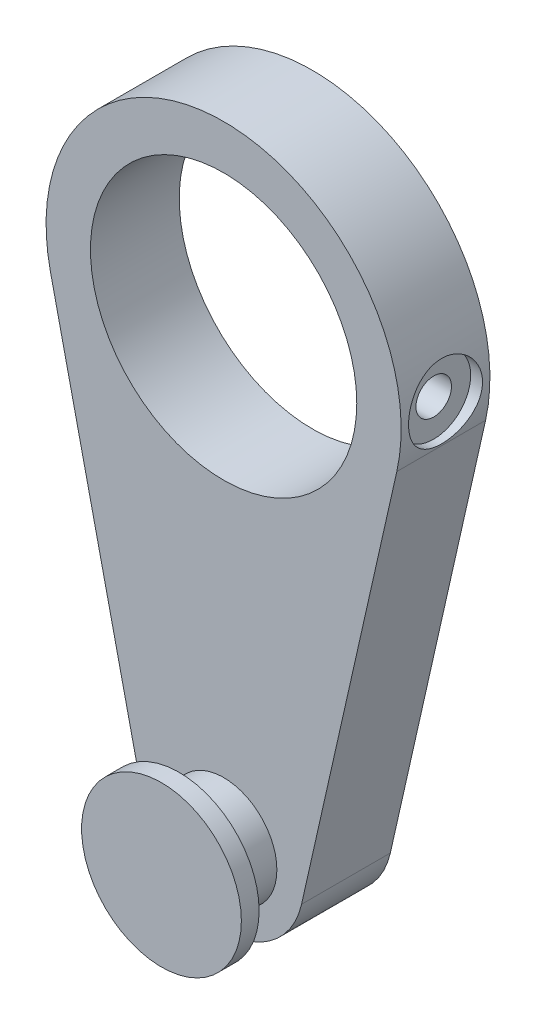
ISO-10303-21;
HEADER;
FILE_DESCRIPTION(('STEP AP214'),'2;1');
FILE_NAME('part.step','',(''),(''),'','','');
FILE_SCHEMA(('AUTOMOTIVE_DESIGN { 1 0 10303 214 1 1 1 1 }'));
ENDSEC;
DATA;
#1=APPLICATION_CONTEXT('core data for automotive mechanical design processes');
#2=APPLICATION_PROTOCOL_DEFINITION('international standard','automotive_design',2000,#1);
#3=PRODUCT_CONTEXT('',#1,'mechanical');
#4=PRODUCT('Part','Part','',(#3));
#5=PRODUCT_RELATED_PRODUCT_CATEGORY('part','',(#4));
#6=PRODUCT_DEFINITION_FORMATION('','',#4);
#7=PRODUCT_DEFINITION_CONTEXT('part definition',#1,'design');
#8=PRODUCT_DEFINITION('design','',#6,#7);
#9=PRODUCT_DEFINITION_SHAPE('','',#8);
#10=(LENGTH_UNIT() NAMED_UNIT(*) SI_UNIT(.MILLI.,.METRE.));
#11=(NAMED_UNIT(*) PLANE_ANGLE_UNIT() SI_UNIT($,.RADIAN.));
#12=(NAMED_UNIT(*) SI_UNIT($,.STERADIAN.) SOLID_ANGLE_UNIT());
#13=UNCERTAINTY_MEASURE_WITH_UNIT(LENGTH_MEASURE(1.E-05),#10,'distance_accuracy_value','');
#14=(GEOMETRIC_REPRESENTATION_CONTEXT(3) GLOBAL_UNCERTAINTY_ASSIGNED_CONTEXT((#13)) GLOBAL_UNIT_ASSIGNED_CONTEXT((#10,
#11,#12)) REPRESENTATION_CONTEXT('',''));
#15=CARTESIAN_POINT('',(0.,0.,0.));
#16=DIRECTION('',(0.,0.,1.));
#17=DIRECTION('',(1.,0.,0.));
#18=AXIS2_PLACEMENT_3D('',#15,#16,#17);
#19=CARTESIAN_POINT('',(0.,3.04561252651886,3.09886775300541));
#20=DIRECTION('',(0.,0.,-1.));
#21=DIRECTION('',(-1.,0.,0.));
#22=AXIS2_PLACEMENT_3D('',#19,#20,#21);
#23=CYLINDRICAL_SURFACE('',#22,5.715);
#24=CARTESIAN_POINT('',(0.,3.04561252651886,-0.711132246994592));
#25=DIRECTION('',(0.,0.,1.));
#26=DIRECTION('',(1.,0.,0.));
#27=AXIS2_PLACEMENT_3D('',#24,#25,#26);
#28=CIRCLE('',#27,5.715);
#29=CARTESIAN_POINT('',(5.715,3.04561252651886,-0.711132246994592));
#30=VERTEX_POINT('',#29);
#31=EDGE_CURVE('E108',#30,#30,#28,.T.);
#32=ORIENTED_EDGE('',*,*,#31,.F.);
#33=EDGE_LOOP('',(#32));
#34=FACE_BOUND('',#33,.T.);
#35=CARTESIAN_POINT('',(0.,3.04561252651886,3.09886775300541));
#36=DIRECTION('',(0.,0.,1.));
#37=DIRECTION('',(1.,0.,0.));
#38=AXIS2_PLACEMENT_3D('',#35,#36,#37);
#39=CIRCLE('',#38,5.715);
#40=CARTESIAN_POINT('',(5.715,3.04561252651886,3.09886775300541));
#41=VERTEX_POINT('',#40);
#42=EDGE_CURVE('E118',#41,#41,#39,.T.);
#43=ORIENTED_EDGE('',*,*,#42,.T.);
#44=EDGE_LOOP('',(#43));
#45=FACE_BOUND('',#44,.T.);
#46=CARTESIAN_POINT('',(5.715,3.04561252651886,1.95586775300541));
#47=CARTESIAN_POINT('',(5.71499937417909,3.00301336012886,1.95586595860708));
#48=CARTESIAN_POINT('',(5.71451868547061,2.9603881684146,1.95228348104171));
#49=CARTESIAN_POINT('',(5.71264736739351,2.87632556824125,1.93804977401753));
#50=CARTESIAN_POINT('',(5.71125580800297,2.83488941900997,1.92739131964959));
#51=CARTESIAN_POINT('',(5.70771939422494,2.75443391940798,1.89932669862212));
#52=CARTESIAN_POINT('',(5.7055750666438,2.71541290127357,1.88192524999976));
#53=CARTESIAN_POINT('',(5.70077112317609,2.64085188251232,1.84087931884522));
#54=CARTESIAN_POINT('',(5.69811159038813,2.60531132190445,1.81723584288099));
#55=CARTESIAN_POINT('',(5.69255527014976,2.53849168814458,1.76421970033421));
#56=CARTESIAN_POINT('',(5.68965724459764,2.50723743404494,1.73481587925718));
#57=CARTESIAN_POINT('',(5.68396045409579,2.45009148360434,1.6711806709672));
#58=CARTESIAN_POINT('',(5.68116169440652,2.42420007110945,1.636949028387));
#59=CARTESIAN_POINT('',(5.67596820902712,2.37842093887432,1.56446678716335));
#60=CARTESIAN_POINT('',(5.67357508068755,2.35855672201024,1.52620121998105));
#61=CARTESIAN_POINT('',(5.66948035791487,2.32554597704108,1.44683991638819));
#62=CARTESIAN_POINT('',(5.6677787337031,2.31239915965435,1.4057443019388));
#63=CARTESIAN_POINT('',(5.66527163832663,2.29327237471688,1.32214823920428));
#64=CARTESIAN_POINT('',(5.66446090386022,2.28725029840825,1.27965758604837));
#65=CARTESIAN_POINT('',(5.66381132263149,2.28241359363053,1.19426163857554));
#66=CARTESIAN_POINT('',(5.66397243157172,2.28359863665484,1.15135636324646));
#67=CARTESIAN_POINT('',(5.66524351749509,2.29310801449038,1.06664380246477));
#68=CARTESIAN_POINT('',(5.66634730821113,2.30138580492285,1.02483118611895));
#69=CARTESIAN_POINT('',(5.66936973607178,2.3247730056619,0.943193818199814));
#70=CARTESIAN_POINT('',(5.67128839179523,2.33988257173271,0.903369111973748));
#71=CARTESIAN_POINT('',(5.67573132483301,2.3765539364833,0.826694382181966));
#72=CARTESIAN_POINT('',(5.67825748061205,2.39813580046748,0.789854068580377));
#73=CARTESIAN_POINT('',(5.68362935999795,2.44712479787712,0.72030034279478));
#74=CARTESIAN_POINT('',(5.68647510021805,2.47453223420477,0.68758714534227));
#75=CARTESIAN_POINT('',(5.69219295607996,2.53465155951842,0.626946225211706));
#76=CARTESIAN_POINT('',(5.69506510289196,2.56740353614178,0.599058232935821));
#77=CARTESIAN_POINT('',(5.70049122974758,2.63714464769803,0.549169253887691));
#78=CARTESIAN_POINT('',(5.70304520887466,2.67413379483632,0.527168284073946));
#79=CARTESIAN_POINT('',(5.70754914016304,2.75133109080155,0.489677219163712));
#80=CARTESIAN_POINT('',(5.70949884466612,2.79154055098035,0.474189792676763));
#81=CARTESIAN_POINT('',(5.71257236669451,2.87402120434675,0.450197922476945));
#82=CARTESIAN_POINT('',(5.71369622824863,2.91629228749326,0.441693106491799));
#83=CARTESIAN_POINT('',(5.71498567964582,3.00135293635179,0.431959790119612));
#84=CARTESIAN_POINT('',(5.71515847256486,3.04413613835644,0.4306765939259));
#85=CARTESIAN_POINT('',(5.71454581576175,3.12930741267919,0.435278337037864));
#86=CARTESIAN_POINT('',(5.71376038932936,3.17169549457556,0.441163102124487));
#87=CARTESIAN_POINT('',(5.71132401811436,3.25471055215215,0.459888265944706));
#88=CARTESIAN_POINT('',(5.70967634149413,3.29534355480995,0.472702406536147));
#89=CARTESIAN_POINT('',(5.70569982525884,3.37388406915921,0.504895153027439));
#90=CARTESIAN_POINT('',(5.70337095965427,3.41179147679182,0.524274009396456));
#91=CARTESIAN_POINT('',(5.69827348037998,3.48404784927158,0.569177164282649));
#92=CARTESIAN_POINT('',(5.69550238232418,3.51837478180397,0.594736629342188));
#93=CARTESIAN_POINT('',(5.68983772638503,3.58227119932277,0.651225961439849));
#94=CARTESIAN_POINT('',(5.68694416294676,3.61184046821252,0.682156072284169));
#95=CARTESIAN_POINT('',(5.68133827842407,3.66557781982086,0.748750460351077));
#96=CARTESIAN_POINT('',(5.67862725883389,3.68970951470891,0.784444225932647));
#97=CARTESIAN_POINT('',(5.67371534673692,3.73163484412914,0.859410488322441));
#98=CARTESIAN_POINT('',(5.67151444283915,3.74942862019328,0.898682905191261));
#99=CARTESIAN_POINT('',(5.6678810128821,3.7781148835867,0.979577062217959));
#100=CARTESIAN_POINT('',(5.6664462524262,3.78902745642515,1.02119157507072));
#101=CARTESIAN_POINT('',(5.66450130254049,3.80370600833734,1.10568287684646));
#102=CARTESIAN_POINT('',(5.66399106365641,3.8074723696749,1.14855959812702));
#103=CARTESIAN_POINT('',(5.66395450123566,3.80774391744044,1.23399600302059));
#104=CARTESIAN_POINT('',(5.6644204298964,3.80430628164988,1.27655551281278));
#105=CARTESIAN_POINT('',(5.6662669905607,3.79038895169515,1.36048586341998));
#106=CARTESIAN_POINT('',(5.66764762222144,3.77990926017011,1.40185670468046));
#107=CARTESIAN_POINT('',(5.67116553193923,3.75222392888457,1.48222519632426));
#108=CARTESIAN_POINT('',(5.67330245573231,3.73502143783941,1.52122394784093));
#109=CARTESIAN_POINT('',(5.67809270416585,3.69438444243346,1.59579070474314));
#110=CARTESIAN_POINT('',(5.68074603877705,3.67094981774079,1.63135864386746));
#111=CARTESIAN_POINT('',(5.68629533496746,3.61830295534009,1.69834590962813));
#112=CARTESIAN_POINT('',(5.68919298692305,3.58904817025335,1.72973166010011));
#113=CARTESIAN_POINT('',(5.69488974939634,3.52568079174169,1.78716979843916));
#114=CARTESIAN_POINT('',(5.6976888366378,3.4915670603369,1.81322093342925));
#115=CARTESIAN_POINT('',(5.70288661987398,3.41927941489079,1.85934793276115));
#116=CARTESIAN_POINT('',(5.70528353388645,3.38108859702231,1.87939749696296));
#117=CARTESIAN_POINT('',(5.70938909171068,3.30187023457163,1.91276926105108));
#118=CARTESIAN_POINT('',(5.71109847208163,3.26084578120639,1.92609866419148));
#119=CARTESIAN_POINT('',(5.71323109984184,3.19061671000436,1.94251294343816));
#120=CARTESIAN_POINT('',(5.71389115144963,3.16185222874401,1.94751365878791));
#121=CARTESIAN_POINT('',(5.71477581384983,3.1039334049046,1.95419166320245));
#122=CARTESIAN_POINT('',(5.71500042848327,3.07477906576678,1.95586898158319));
#123=CARTESIAN_POINT('',(5.715,3.04561252651886,1.95586775300541));
#124=B_SPLINE_CURVE_WITH_KNOTS('',3,(#46,#47,#48,#49,#50,#51,#52,#53,#54,#55,#56,#57,#58,#59,
#60,#61,#62,#63,#64,#65,#66,#67,#68,#69,#70,#71,#72,#73,#74,#75,#76,#77,#78,#79,#80,#81,#82,#83,
#84,#85,#86,#87,#88,#89,#90,#91,#92,#93,#94,#95,#96,#97,#98,#99,#100,#101,#102,#103,#104,#105,
#106,#107,#108,#109,#110,#111,#112,#113,#114,#115,#116,#117,#118,#119,#120,#121,#122,#123),
.UNSPECIFIED.,.T.,.F.,(4,2,2,2,2,2,2,2,2,2,2,2,2,2,2,2,2,2,2,2,2,2,2,2,2,2,2,2,2,2,2,2,2,2,2,2,
2,2,4),(0.,0.127690950347488,0.255512480167202,0.383244734967242,0.510956404668972,
0.63937887786996,0.767808146517425,0.896731968959377,1.02565023888924,1.15380270603371,
1.28194933192395,1.40926141222355,1.53657639537999,1.66429023175539,1.79201071027087,
1.92073737448728,2.04946440951725,2.17824413297167,2.30701699019254,2.43481320881975,
2.56260632139056,2.68991853454052,2.81723560568851,2.94529487687326,3.07335996296588,
3.20225815428006,3.33115346699031,3.45967078474208,3.58818122767565,3.71567555376214,
3.84316983206792,3.97060446810699,4.09804156487039,4.22644697445175,4.35488250656692,
4.4838728966299,4.61272472802111,4.70015216577024,4.78757883231152),.UNSPECIFIED.);
#125=CARTESIAN_POINT('',(5.715,3.04561252651886,1.95586775300541));
#126=VERTEX_POINT('',#125);
#127=EDGE_CURVE('E182',#126,#126,#124,.T.);
#128=ORIENTED_EDGE('',*,*,#127,.T.);
#129=EDGE_LOOP('',(#128));
#130=FACE_BOUND('',#129,.T.);
#131=ADVANCED_FACE('F41',(#34,#45,#130),#23,.F.);
#132=CARTESIAN_POINT('',(0.,3.04561252651886,3.09886775300541));
#133=DIRECTION('',(0.,0.,-1.));
#134=DIRECTION('',(-1.,0.,0.));
#135=AXIS2_PLACEMENT_3D('',#132,#133,#134);
#136=CYLINDRICAL_SURFACE('',#135,7.62);
#137=CARTESIAN_POINT('',(0.,3.04561252651886,-0.711132246994592));
#138=DIRECTION('',(0.,0.,1.));
#139=DIRECTION('',(1.,0.,0.));
#140=AXIS2_PLACEMENT_3D('',#137,#138,#139);
#141=CIRCLE('',#140,7.62);
#142=CARTESIAN_POINT('',(7.43330902357759,1.36921252651886,-0.711132246994592));
#143=VERTEX_POINT('',#142);
#144=CARTESIAN_POINT('',(-7.43330902357759,1.36921252651886,-0.711132246994592));
#145=VERTEX_POINT('',#144);
#146=EDGE_CURVE('E111',#143,#145,#141,.T.);
#147=ORIENTED_EDGE('',*,*,#146,.T.);
#148=DIRECTION('',(0.,0.,-1.));
#149=VECTOR('',#148,1.);
#150=CARTESIAN_POINT('',(-7.43330902357759,1.36921252651886,3.09886775300541));
#151=LINE('',#150,#149);
#152=CARTESIAN_POINT('',(-7.43330902357759,1.36921252651886,3.09886775300541));
#153=VERTEX_POINT('',#152);
#154=EDGE_CURVE('E11',#153,#145,#151,.T.);
#155=ORIENTED_EDGE('',*,*,#154,.F.);
#156=CARTESIAN_POINT('',(0.,3.04561252651886,3.09886775300541));
#157=DIRECTION('',(0.,0.,1.));
#158=DIRECTION('',(1.,0.,0.));
#159=AXIS2_PLACEMENT_3D('',#156,#157,#158);
#160=CIRCLE('',#159,7.62);
#161=CARTESIAN_POINT('',(7.43330902357759,1.36921252651886,3.09886775300541));
#162=VERTEX_POINT('',#161);
#163=EDGE_CURVE('E95',#162,#153,#160,.T.);
#164=ORIENTED_EDGE('',*,*,#163,.F.);
#165=DIRECTION('',(0.,0.,-1.));
#166=VECTOR('',#165,1.);
#167=CARTESIAN_POINT('',(7.43330902357759,1.36921252651886,3.09886775300541));
#168=LINE('',#167,#166);
#169=EDGE_CURVE('E104',#162,#143,#168,.T.);
#170=ORIENTED_EDGE('',*,*,#169,.T.);
#171=EDGE_LOOP('',(#147,#155,#164,#170));
#172=FACE_BOUND('',#171,.T.);
#173=CARTESIAN_POINT('',(7.62,3.04561252651886,2.78136775300541));
#174=CARTESIAN_POINT('',(7.61999836838847,2.95746304355775,2.78136460661949));
#175=CARTESIAN_POINT('',(7.61845477544304,2.86927456382735,2.7740009075426));
#176=CARTESIAN_POINT('',(7.61244605258163,2.69539565485978,2.74476717909869));
#177=CARTESIAN_POINT('',(7.60797870310345,2.6097071751559,2.72288612874851));
#178=CARTESIAN_POINT('',(7.59662068679176,2.44336692850886,2.6653272752547));
#179=CARTESIAN_POINT('',(7.58973243356859,2.36271023889819,2.62966321008682));
#180=CARTESIAN_POINT('',(7.5742790831852,2.20852970918929,2.54559274975806));
#181=CARTESIAN_POINT('',(7.56571406114988,2.13500554975026,2.4971869254375));
#182=CARTESIAN_POINT('',(7.54770779031306,1.99609681464664,2.38825660096329));
#183=CARTESIAN_POINT('',(7.53825652427635,1.93083161643225,2.32758151143685));
#184=CARTESIAN_POINT('',(7.51961485269409,1.81132775002173,2.19615853582762));
#185=CARTESIAN_POINT('',(7.51042446879187,1.7570899943984,2.12540981692763));
#186=CARTESIAN_POINT('',(7.49324692096041,1.66066442421821,1.97497875267239));
#187=CARTESIAN_POINT('',(7.48527262372032,1.61860173207459,1.89521460468692));
#188=CARTESIAN_POINT('',(7.47157307625526,1.54852231079845,1.72955698925401));
#189=CARTESIAN_POINT('',(7.46584758373811,1.52050406838981,1.64366418330339));
#190=CARTESIAN_POINT('',(7.45739556252376,1.4796994768204,1.46947650148755));
#191=CARTESIAN_POINT('',(7.45462767206949,1.46670283576951,1.38123293665025));
#192=CARTESIAN_POINT('',(7.45227987209943,1.45565688429255,1.20377776256987));
#193=CARTESIAN_POINT('',(7.45269960817246,1.45760591215634,1.11456626204648));
#194=CARTESIAN_POINT('',(7.45664211385352,1.47622629474646,0.939256847476933));
#195=CARTESIAN_POINT('',(7.46011377773474,1.49265519006331,0.853131858835668));
#196=CARTESIAN_POINT('',(7.46968835772246,1.53938562368856,0.68488793575635));
#197=CARTESIAN_POINT('',(7.47579140908473,1.56968787510531,0.602769207485367));
#198=CARTESIAN_POINT('',(7.48999253159409,1.64353248570197,0.444177572917112));
#199=CARTESIAN_POINT('',(7.49810481307694,1.68716969433405,0.367750156416025));
#200=CARTESIAN_POINT('',(7.51540140313616,1.78637869843984,0.223212157784844));
#201=CARTESIAN_POINT('',(7.52458584486142,1.84195197694537,0.155102610783718));
#202=CARTESIAN_POINT('',(7.54321238280984,1.96474737615444,0.0277360224333349));
#203=CARTESIAN_POINT('',(7.55265600463331,2.03217610608551,-0.0313217814937999));
#204=CARTESIAN_POINT('',(7.57057271941611,2.17608506998188,-0.137321408625389));
#205=CARTESIAN_POINT('',(7.579045797812,2.25256543973614,-0.184263050034556));
#206=CARTESIAN_POINT('',(7.59409036097375,2.4126374891498,-0.264740050545252));
#207=CARTESIAN_POINT('',(7.60065840432028,2.49624168987221,-0.298251188794833));
#208=CARTESIAN_POINT('',(7.61112699528327,2.66806105788422,-0.350695712135669));
#209=CARTESIAN_POINT('',(7.61502789406988,2.7562756165031,-0.369631016398471));
#210=CARTESIAN_POINT('',(7.61967329523629,2.9331008570788,-0.392100947120807));
#211=CARTESIAN_POINT('',(7.62047362792725,3.02167549600061,-0.395908012692289));
#212=CARTESIAN_POINT('',(7.61898339361023,3.19819515094116,-0.388749160533832));
#213=CARTESIAN_POINT('',(7.61669301586155,3.28614020518093,-0.377784147370564));
#214=CARTESIAN_POINT('',(7.60931377523564,3.45801501276102,-0.341618567088285));
#215=CARTESIAN_POINT('',(7.60425267142458,3.5419757614945,-0.316559140557589));
#216=CARTESIAN_POINT('',(7.59189778597841,3.70450306377875,-0.253071364259405));
#217=CARTESIAN_POINT('',(7.58460382675615,3.78306918766656,-0.214641951094798));
#218=CARTESIAN_POINT('',(7.56845376693207,3.9337162963371,-0.124925166632892));
#219=CARTESIAN_POINT('',(7.55957840141659,4.00569851524555,-0.073475496441884));
#220=CARTESIAN_POINT('',(7.5412926174063,4.14010544279474,0.0406055981122727));
#221=CARTESIAN_POINT('',(7.53188213638989,4.20252903146873,0.103238330914463));
#222=CARTESIAN_POINT('',(7.51339651154848,4.31710941030665,0.239152335795027));
#223=CARTESIAN_POINT('',(7.50432953420526,4.36907844194146,0.312593203588615));
#224=CARTESIAN_POINT('',(7.48773713290073,4.45994445882525,0.467321433956916));
#225=CARTESIAN_POINT('',(7.48021164476207,4.49884198832773,0.548608469662072));
#226=CARTESIAN_POINT('',(7.46762159899212,4.56221155635667,0.716298472304161));
#227=CARTESIAN_POINT('',(7.46254378436552,4.58676146133486,0.80267097020602));
#228=CARTESIAN_POINT('',(7.45539764581315,4.62097181576613,0.978433272130579));
#229=CARTESIAN_POINT('',(7.45332889138666,4.63063439513326,1.0678226426621));
#230=CARTESIAN_POINT('',(7.45246042281803,4.63471179291152,1.24519277227496));
#231=CARTESIAN_POINT('',(7.45359700948307,4.62942371782747,1.33316652218742));
#232=CARTESIAN_POINT('',(7.45886808013758,4.60440932400706,1.50694054433409));
#233=CARTESIAN_POINT('',(7.46300253535225,4.58468314385364,1.59274083742186));
#234=CARTESIAN_POINT('',(7.47377388208599,4.53148989217989,1.75952292330655));
#235=CARTESIAN_POINT('',(7.48040359400071,4.49806221963781,1.8405177760438));
#236=CARTESIAN_POINT('',(7.49542196288197,4.41845023422578,1.99579499855927));
#237=CARTESIAN_POINT('',(7.50381078312134,4.37226473710334,2.07007674433948));
#238=CARTESIAN_POINT('',(7.52159506029955,4.26744611960372,2.2112922193963));
#239=CARTESIAN_POINT('',(7.53100619612873,4.20859964735001,2.27806564120294));
#240=CARTESIAN_POINT('',(7.5496653627068,4.08056656292533,2.40088780940289));
#241=CARTESIAN_POINT('',(7.55891335540797,4.01137757343673,2.4569340832958));
#242=CARTESIAN_POINT('',(7.576330345755,3.86366324945364,2.55732524094916));
#243=CARTESIAN_POINT('',(7.5844856701302,3.78503944685097,2.60152772646099));
#244=CARTESIAN_POINT('',(7.59866283787497,3.6213287283969,2.67602154311154));
#245=CARTESIAN_POINT('',(7.60468654551268,3.53624753954106,2.70632503692639));
#246=CARTESIAN_POINT('',(7.61279274722433,3.38345194850199,2.74649390643171));
#247=CARTESIAN_POINT('',(7.61547925289972,3.31658937055333,2.75954758228066));
#248=CARTESIAN_POINT('',(7.61908347642993,3.18169642272306,2.77698555993762));
#249=CARTESIAN_POINT('',(7.62000125964424,3.11366609608693,2.78137018209274));
#250=CARTESIAN_POINT('',(7.62,3.04561252651886,2.78136775300541));
#251=B_SPLINE_CURVE_WITH_KNOTS('',3,(#173,#174,#175,#176,#177,#178,#179,#180,#181,#182,#183,
#184,#185,#186,#187,#188,#189,#190,#191,#192,#193,#194,#195,#196,#197,#198,#199,#200,#201,#202,
#203,#204,#205,#206,#207,#208,#209,#210,#211,#212,#213,#214,#215,#216,#217,#218,#219,#220,#221,
#222,#223,#224,#225,#226,#227,#228,#229,#230,#231,#232,#233,#234,#235,#236,#237,#238,#239,#240,
#241,#242,#243,#244,#245,#246,#247,#248,#249,#250),.UNSPECIFIED.,.T.,.F.,(4,2,2,2,2,2,2,2,2,2,2,
2,2,2,2,2,2,2,2,2,2,2,2,2,2,2,2,2,2,2,2,2,2,2,2,2,2,2,4),(0.,0.264199427281043,
0.528599653880906,0.792737021108313,1.0568625567977,1.32445158512916,1.59206274870768,
1.86233370456757,2.13257553272573,2.39898650465715,2.66536785654299,2.92737174403906,
3.18938910038455,3.45331532369271,3.71727435827404,3.98639698471442,4.25552364893337,
4.52513350114572,4.7947078482813,5.05940491047748,5.32408576471393,5.5861621402343,
5.84825936506485,6.11380011674586,6.37937195757009,6.64935505063257,6.91932690111163,
7.18781963620682,7.45627395476015,7.71943113579619,7.98258579097329,8.24498898869435,
8.5074165523348,8.77467161534493,9.0419882039906,9.31238757785786,9.58254987810517,
9.78652587366146,9.99049433156208),.UNSPECIFIED.);
#252=CARTESIAN_POINT('',(7.62,3.04561252651886,2.78136775300541));
#253=VERTEX_POINT('',#252);
#254=EDGE_CURVE('E120',#253,#253,#251,.T.);
#255=ORIENTED_EDGE('',*,*,#254,.F.);
#256=EDGE_LOOP('',(#255));
#257=FACE_BOUND('',#256,.T.);
#258=ADVANCED_FACE('F128',(#172,#257),#136,.T.);
#259=CARTESIAN_POINT('',(-7.43330902357759,1.36921252651886,3.09886775300541));
#260=DIRECTION('',(0.975499871860576,0.22,0.));
#261=DIRECTION('',(-0.22,0.975499871860576,0.));
#262=AXIS2_PLACEMENT_3D('',#259,#260,#261);
#263=PLANE('',#262);
#264=DIRECTION('',(0.22,-0.975499871860576,0.));
#265=VECTOR('',#264,1.);
#266=CARTESIAN_POINT('',(-7.43330902357759,1.36921252651886,-0.711132246994592));
#267=LINE('',#266,#265);
#268=CARTESIAN_POINT('',(-3.34498906060992,-16.7587674734811,-0.711132246994592));
#269=VERTEX_POINT('',#268);
#270=EDGE_CURVE('E99',#145,#269,#267,.T.);
#271=ORIENTED_EDGE('',*,*,#270,.T.);
#272=DIRECTION('',(0.,0.,-1.));
#273=VECTOR('',#272,1.);
#274=CARTESIAN_POINT('',(-3.34498906060992,-16.7587674734811,3.09886775300541));
#275=LINE('',#274,#273);
#276=CARTESIAN_POINT('',(-3.34498906060992,-16.7587674734811,3.09886775300541));
#277=VERTEX_POINT('',#276);
#278=EDGE_CURVE('E51',#277,#269,#275,.T.);
#279=ORIENTED_EDGE('',*,*,#278,.F.);
#280=DIRECTION('',(0.22,-0.975499871860576,0.));
#281=VECTOR('',#280,1.);
#282=CARTESIAN_POINT('',(-7.43330902357759,1.36921252651886,3.09886775300541));
#283=LINE('',#282,#281);
#284=EDGE_CURVE('E90',#153,#277,#283,.T.);
#285=ORIENTED_EDGE('',*,*,#284,.F.);
#286=ORIENTED_EDGE('',*,*,#154,.T.);
#287=EDGE_LOOP('',(#271,#279,#285,#286));
#288=FACE_BOUND('',#287,.T.);
#289=ADVANCED_FACE('F98',(#288),#263,.F.);
#290=CARTESIAN_POINT('',(0.,-16.0043874734811,3.09886775300541));
#291=DIRECTION('',(0.,0.,-1.));
#292=DIRECTION('',(-1.,0.,0.));
#293=AXIS2_PLACEMENT_3D('',#290,#291,#292);
#294=CYLINDRICAL_SURFACE('',#293,3.429);
#295=CARTESIAN_POINT('',(0.,-16.0043874734811,-0.711132246994592));
#296=DIRECTION('',(0.,0.,1.));
#297=DIRECTION('',(1.,0.,0.));
#298=AXIS2_PLACEMENT_3D('',#295,#296,#297);
#299=CIRCLE('',#298,3.429);
#300=CARTESIAN_POINT('',(3.34498906060991,-16.7587674734811,-0.711132246994592));
#301=VERTEX_POINT('',#300);
#302=EDGE_CURVE('E77',#269,#301,#299,.T.);
#303=ORIENTED_EDGE('',*,*,#302,.T.);
#304=DIRECTION('',(0.,0.,-1.));
#305=VECTOR('',#304,1.);
#306=CARTESIAN_POINT('',(3.34498906060991,-16.7587674734811,3.09886775300541));
#307=LINE('',#306,#305);
#308=CARTESIAN_POINT('',(3.34498906060991,-16.7587674734811,3.09886775300541));
#309=VERTEX_POINT('',#308);
#310=EDGE_CURVE('E100',#309,#301,#307,.T.);
#311=ORIENTED_EDGE('',*,*,#310,.F.);
#312=CARTESIAN_POINT('',(0.,-16.0043874734811,3.09886775300541));
#313=DIRECTION('',(0.,0.,1.));
#314=DIRECTION('',(1.,0.,0.));
#315=AXIS2_PLACEMENT_3D('',#312,#313,#314);
#316=CIRCLE('',#315,3.429);
#317=EDGE_CURVE('E93',#277,#309,#316,.T.);
#318=ORIENTED_EDGE('',*,*,#317,.F.);
#319=ORIENTED_EDGE('',*,*,#278,.T.);
#320=EDGE_LOOP('',(#303,#311,#318,#319));
#321=FACE_BOUND('',#320,.T.);
#322=ADVANCED_FACE('F102',(#321),#294,.T.);
#323=CARTESIAN_POINT('',(7.43330902357759,1.36921252651886,3.09886775300541));
#324=DIRECTION('',(-0.975499871860576,0.22,0.));
#325=DIRECTION('',(-0.22,-0.975499871860576,0.));
#326=AXIS2_PLACEMENT_3D('',#323,#324,#325);
#327=PLANE('',#326);
#328=DIRECTION('',(0.22,0.975499871860576,0.));
#329=VECTOR('',#328,1.);
#330=CARTESIAN_POINT('',(7.43330902357759,1.36921252651886,-0.711132246994592));
#331=LINE('',#330,#329);
#332=EDGE_CURVE('E83',#301,#143,#331,.T.);
#333=ORIENTED_EDGE('',*,*,#332,.T.);
#334=ORIENTED_EDGE('',*,*,#169,.F.);
#335=DIRECTION('',(0.22,0.975499871860576,0.));
#336=VECTOR('',#335,1.);
#337=CARTESIAN_POINT('',(7.43330902357759,1.36921252651886,3.09886775300541));
#338=LINE('',#337,#336);
#339=EDGE_CURVE('E60',#309,#162,#338,.T.);
#340=ORIENTED_EDGE('',*,*,#339,.F.);
#341=ORIENTED_EDGE('',*,*,#310,.T.);
#342=EDGE_LOOP('',(#333,#334,#340,#341));
#343=FACE_BOUND('',#342,.T.);
#344=ADVANCED_FACE('F158',(#343),#327,.F.);
#345=CARTESIAN_POINT('',(0.,3.04561252651886,3.09886775300541));
#346=DIRECTION('',(0.,0.,1.));
#347=DIRECTION('',(1.,0.,0.));
#348=AXIS2_PLACEMENT_3D('',#345,#346,#347);
#349=PLANE('',#348);
#350=CARTESIAN_POINT('',(0.,-16.0043874734811,3.09886775300541));
#351=DIRECTION('',(0.,0.,1.));
#352=DIRECTION('',(1.,0.,0.));
#353=AXIS2_PLACEMENT_3D('',#350,#351,#352);
#354=CIRCLE('',#353,2.286);
#355=CARTESIAN_POINT('',(2.286,-16.0043874734811,3.09886775300541));
#356=VERTEX_POINT('',#355);
#357=EDGE_CURVE('E327',#356,#356,#354,.T.);
#358=ORIENTED_EDGE('',*,*,#357,.F.);
#359=EDGE_LOOP('',(#358));
#360=FACE_BOUND('',#359,.T.);
#361=ORIENTED_EDGE('',*,*,#42,.F.);
#362=EDGE_LOOP('',(#361));
#363=FACE_BOUND('',#362,.T.);
#364=ORIENTED_EDGE('',*,*,#163,.T.);
#365=ORIENTED_EDGE('',*,*,#284,.T.);
#366=ORIENTED_EDGE('',*,*,#317,.T.);
#367=ORIENTED_EDGE('',*,*,#339,.T.);
#368=EDGE_LOOP('',(#364,#365,#366,#367));
#369=FACE_BOUND('',#368,.T.);
#370=ADVANCED_FACE('F91',(#360,#363,#369),#349,.T.);
#371=CARTESIAN_POINT('',(0.,3.04561252651886,-0.711132246994592));
#372=DIRECTION('',(0.,0.,1.));
#373=DIRECTION('',(1.,0.,0.));
#374=AXIS2_PLACEMENT_3D('',#371,#372,#373);
#375=PLANE('',#374);
#376=ORIENTED_EDGE('',*,*,#31,.T.);
#377=EDGE_LOOP('',(#376));
#378=FACE_BOUND('',#377,.T.);
#379=ORIENTED_EDGE('',*,*,#146,.F.);
#380=ORIENTED_EDGE('',*,*,#332,.F.);
#381=ORIENTED_EDGE('',*,*,#302,.F.);
#382=ORIENTED_EDGE('',*,*,#270,.F.);
#383=EDGE_LOOP('',(#379,#380,#381,#382));
#384=FACE_BOUND('',#383,.T.);
#385=ADVANCED_FACE('F154',(#378,#384),#375,.F.);
#386=CARTESIAN_POINT('',(0.,-16.0043874734811,5.00386775300541));
#387=DIRECTION('',(0.,0.,-1.));
#388=DIRECTION('',(-1.,0.,0.));
#389=AXIS2_PLACEMENT_3D('',#386,#387,#388);
#390=CYLINDRICAL_SURFACE('',#389,2.286);
#391=CARTESIAN_POINT('',(0.,-16.0043874734811,5.00386775300541));
#392=DIRECTION('',(0.,0.,1.));
#393=DIRECTION('',(1.,0.,0.));
#394=AXIS2_PLACEMENT_3D('',#391,#392,#393);
#395=CIRCLE('',#394,2.286);
#396=CARTESIAN_POINT('',(2.286,-16.0043874734811,5.00386775300541));
#397=VERTEX_POINT('',#396);
#398=EDGE_CURVE('E112',#397,#397,#395,.T.);
#399=ORIENTED_EDGE('',*,*,#398,.F.);
#400=EDGE_LOOP('',(#399));
#401=FACE_BOUND('',#400,.T.);
#402=ORIENTED_EDGE('',*,*,#357,.T.);
#403=EDGE_LOOP('',(#402));
#404=FACE_BOUND('',#403,.T.);
#405=ADVANCED_FACE('F150',(#401,#404),#390,.T.);
#406=CARTESIAN_POINT('',(0.,-16.0043874734811,5.76586775300541));
#407=DIRECTION('',(0.,0.,-1.));
#408=DIRECTION('',(-1.,0.,0.));
#409=AXIS2_PLACEMENT_3D('',#406,#407,#408);
#410=CYLINDRICAL_SURFACE('',#409,3.429);
#411=CARTESIAN_POINT('',(0.,-16.0043874734811,5.76586775300541));
#412=DIRECTION('',(0.,0.,1.));
#413=DIRECTION('',(1.,0.,0.));
#414=AXIS2_PLACEMENT_3D('',#411,#412,#413);
#415=CIRCLE('',#414,3.429);
#416=CARTESIAN_POINT('',(3.429,-16.0043874734811,5.76586775300541));
#417=VERTEX_POINT('',#416);
#418=EDGE_CURVE('E324',#417,#417,#415,.T.);
#419=ORIENTED_EDGE('',*,*,#418,.F.);
#420=EDGE_LOOP('',(#419));
#421=FACE_BOUND('',#420,.T.);
#422=CARTESIAN_POINT('',(0.,-16.0043874734811,5.00386775300541));
#423=DIRECTION('',(0.,0.,1.));
#424=DIRECTION('',(1.,0.,0.));
#425=AXIS2_PLACEMENT_3D('',#422,#423,#424);
#426=CIRCLE('',#425,3.429);
#427=CARTESIAN_POINT('',(3.429,-16.0043874734811,5.00386775300541));
#428=VERTEX_POINT('',#427);
#429=EDGE_CURVE('E126',#428,#428,#426,.T.);
#430=ORIENTED_EDGE('',*,*,#429,.T.);
#431=EDGE_LOOP('',(#430));
#432=FACE_BOUND('',#431,.T.);
#433=ADVANCED_FACE('F143',(#421,#432),#410,.T.);
#434=CARTESIAN_POINT('',(0.,-16.0043874734811,5.76586775300541));
#435=DIRECTION('',(0.,0.,1.));
#436=DIRECTION('',(1.,0.,0.));
#437=AXIS2_PLACEMENT_3D('',#434,#435,#436);
#438=PLANE('',#437);
#439=ORIENTED_EDGE('',*,*,#418,.T.);
#440=EDGE_LOOP('',(#439));
#441=FACE_BOUND('',#440,.T.);
#442=ADVANCED_FACE('F140',(#441),#438,.T.);
#443=CARTESIAN_POINT('',(0.,-16.0043874734811,5.00386775300541));
#444=DIRECTION('',(0.,0.,1.));
#445=DIRECTION('',(1.,0.,0.));
#446=AXIS2_PLACEMENT_3D('',#443,#444,#445);
#447=PLANE('',#446);
#448=ORIENTED_EDGE('',*,*,#398,.T.);
#449=EDGE_LOOP('',(#448));
#450=FACE_BOUND('',#449,.T.);
#451=ORIENTED_EDGE('',*,*,#429,.F.);
#452=EDGE_LOOP('',(#451));
#453=FACE_BOUND('',#452,.T.);
#454=ADVANCED_FACE('F137',(#450,#453),#447,.F.);
#455=CARTESIAN_POINT('',(17.112,3.04561252651886,1.19386775300541));
#456=DIRECTION('',(-1.,0.,0.));
#457=DIRECTION('',(0.,0.,1.));
#458=AXIS2_PLACEMENT_3D('',#455,#456,#457);
#459=CYLINDRICAL_SURFACE('',#458,1.5875);
#460=CARTESIAN_POINT('',(7.112,3.04561252651886,1.19386775300541));
#461=DIRECTION('',(1.,0.,0.));
#462=DIRECTION('',(0.,0.,-1.));
#463=AXIS2_PLACEMENT_3D('',#460,#461,#462);
#464=CIRCLE('',#463,1.5875);
#465=CARTESIAN_POINT('',(7.112,3.04561252651886,-0.393632246994592));
#466=VERTEX_POINT('',#465);
#467=EDGE_CURVE('E127',#466,#466,#464,.T.);
#468=ORIENTED_EDGE('',*,*,#467,.F.);
#469=EDGE_LOOP('',(#468));
#470=FACE_BOUND('',#469,.T.);
#471=ORIENTED_EDGE('',*,*,#254,.T.);
#472=EDGE_LOOP('',(#471));
#473=FACE_BOUND('',#472,.T.);
#474=ADVANCED_FACE('F131',(#470,#473),#459,.F.);
#475=CARTESIAN_POINT('',(7.112,3.04561252651886,1.19386775300541));
#476=DIRECTION('',(1.,0.,0.));
#477=DIRECTION('',(0.,0.,-1.));
#478=AXIS2_PLACEMENT_3D('',#475,#476,#477);
#479=PLANE('',#478);
#480=CARTESIAN_POINT('',(7.112,3.04561252651886,1.19386775300541));
#481=DIRECTION('',(1.,0.,0.));
#482=DIRECTION('',(0.,0.,-1.));
#483=AXIS2_PLACEMENT_3D('',#480,#481,#482);
#484=CIRCLE('',#483,0.762);
#485=CARTESIAN_POINT('',(7.112,3.04561252651886,0.431867753005408));
#486=VERTEX_POINT('',#485);
#487=EDGE_CURVE('E45',#486,#486,#484,.F.);
#488=ORIENTED_EDGE('',*,*,#487,.T.);
#489=EDGE_LOOP('',(#488));
#490=FACE_BOUND('',#489,.T.);
#491=ORIENTED_EDGE('',*,*,#467,.T.);
#492=EDGE_LOOP('',(#491));
#493=FACE_BOUND('',#492,.T.);
#494=ADVANCED_FACE('F136',(#490,#493),#479,.T.);
#495=CARTESIAN_POINT('',(7.62,3.04561252651886,1.19386775300541));
#496=DIRECTION('',(-1.,0.,0.));
#497=DIRECTION('',(0.,0.,1.));
#498=AXIS2_PLACEMENT_3D('',#495,#496,#497);
#499=CYLINDRICAL_SURFACE('',#498,0.762);
#500=ORIENTED_EDGE('',*,*,#127,.F.);
#501=EDGE_LOOP('',(#500));
#502=FACE_BOUND('',#501,.T.);
#503=ORIENTED_EDGE('',*,*,#487,.F.);
#504=EDGE_LOOP('',(#503));
#505=FACE_BOUND('',#504,.T.);
#506=ADVANCED_FACE('F192',(#502,#505),#499,.F.);
#507=CLOSED_SHELL('',(#131,#258,#289,#322,#344,#370,#385,#405,#433,#442,#454,#474,#494,#506));
#508=MANIFOLD_SOLID_BREP('B2',#507);
#509=ADVANCED_BREP_SHAPE_REPRESENTATION('',(#18,#508),#14);
#510=SHAPE_DEFINITION_REPRESENTATION(#9,#509);
ENDSEC;
END-ISO-10303-21;
